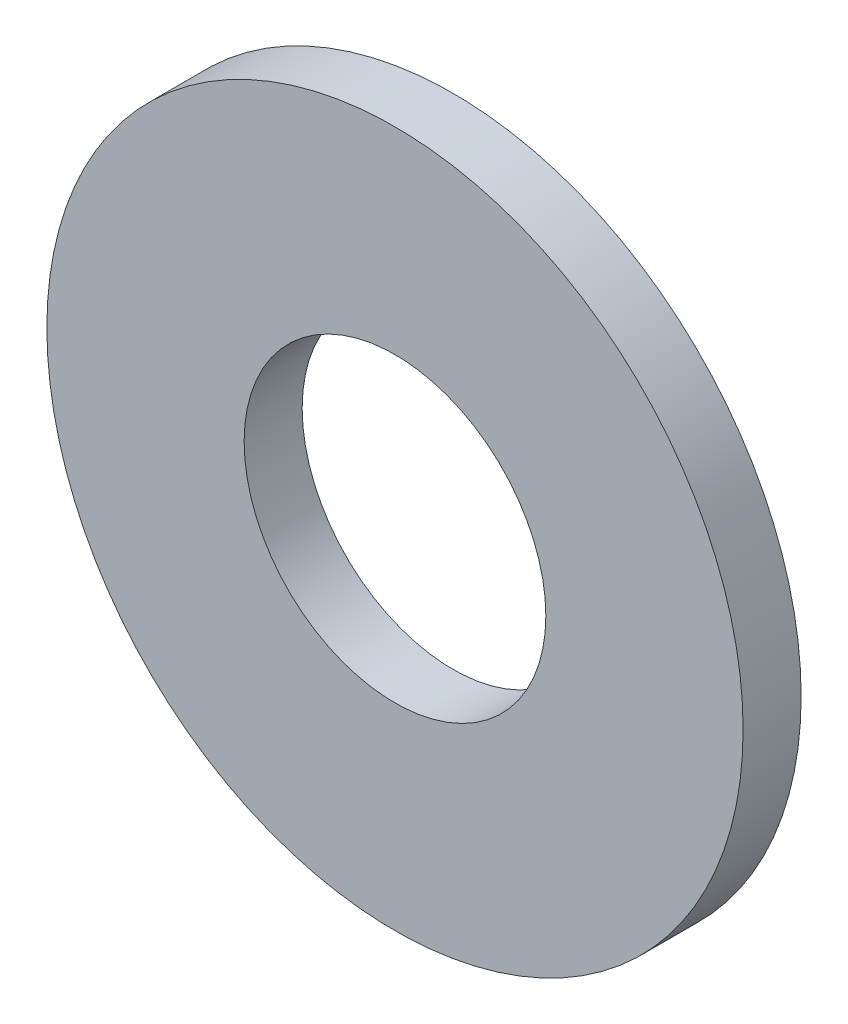
ISO-10303-21;
HEADER;
FILE_DESCRIPTION(('STEP AP214'),'2;1');
FILE_NAME('part.step','',(''),(''),'','','');
FILE_SCHEMA(('AUTOMOTIVE_DESIGN { 1 0 10303 214 1 1 1 1 }'));
ENDSEC;
DATA;
#1=APPLICATION_CONTEXT('core data for automotive mechanical design processes');
#2=APPLICATION_PROTOCOL_DEFINITION('international standard','automotive_design',2000,#1);
#3=PRODUCT_CONTEXT('',#1,'mechanical');
#4=PRODUCT('Part','Part','',(#3));
#5=PRODUCT_RELATED_PRODUCT_CATEGORY('part','',(#4));
#6=PRODUCT_DEFINITION_FORMATION('','',#4);
#7=PRODUCT_DEFINITION_CONTEXT('part definition',#1,'design');
#8=PRODUCT_DEFINITION('design','',#6,#7);
#9=PRODUCT_DEFINITION_SHAPE('','',#8);
#10=(LENGTH_UNIT() NAMED_UNIT(*) SI_UNIT(.MILLI.,.METRE.));
#11=(NAMED_UNIT(*) PLANE_ANGLE_UNIT() SI_UNIT($,.RADIAN.));
#12=(NAMED_UNIT(*) SI_UNIT($,.STERADIAN.) SOLID_ANGLE_UNIT());
#13=UNCERTAINTY_MEASURE_WITH_UNIT(LENGTH_MEASURE(1.E-05),#10,'distance_accuracy_value','');
#14=(GEOMETRIC_REPRESENTATION_CONTEXT(3) GLOBAL_UNCERTAINTY_ASSIGNED_CONTEXT((#13)) GLOBAL_UNIT_ASSIGNED_CONTEXT((#10,
#11,#12)) REPRESENTATION_CONTEXT('',''));
#15=CARTESIAN_POINT('',(0.,0.,0.));
#16=DIRECTION('',(0.,0.,1.));
#17=DIRECTION('',(1.,0.,0.));
#18=AXIS2_PLACEMENT_3D('',#15,#16,#17);
#19=CARTESIAN_POINT('',(0.,0.,1.));
#20=DIRECTION('',(0.,0.,1.));
#21=DIRECTION('',(1.,0.,0.));
#22=AXIS2_PLACEMENT_3D('',#19,#20,#21);
#23=PLANE('',#22);
#24=CARTESIAN_POINT('',(0.,0.,1.));
#25=DIRECTION('',(0.,0.,1.));
#26=DIRECTION('',(1.,0.,0.));
#27=AXIS2_PLACEMENT_3D('',#24,#25,#26);
#28=CIRCLE('',#27,6.);
#29=CARTESIAN_POINT('',(6.,0.,1.));
#30=VERTEX_POINT('',#29);
#31=EDGE_CURVE('E10',#30,#30,#28,.T.);
#32=ORIENTED_EDGE('',*,*,#31,.T.);
#33=EDGE_LOOP('',(#32));
#34=FACE_BOUND('',#33,.T.);
#35=CARTESIAN_POINT('',(0.,0.,1.));
#36=DIRECTION('',(0.,0.,1.));
#37=DIRECTION('',(1.,0.,0.));
#38=AXIS2_PLACEMENT_3D('',#35,#36,#37);
#39=CIRCLE('',#38,2.6);
#40=CARTESIAN_POINT('',(2.6,0.,1.));
#41=VERTEX_POINT('',#40);
#42=EDGE_CURVE('E42',#41,#41,#39,.T.);
#43=ORIENTED_EDGE('',*,*,#42,.F.);
#44=EDGE_LOOP('',(#43));
#45=FACE_BOUND('',#44,.T.);
#46=ADVANCED_FACE('F31',(#34,#45),#23,.T.);
#47=CARTESIAN_POINT('',(0.,0.,0.));
#48=DIRECTION('',(0.,0.,1.));
#49=DIRECTION('',(1.,0.,0.));
#50=AXIS2_PLACEMENT_3D('',#47,#48,#49);
#51=PLANE('',#50);
#52=CARTESIAN_POINT('',(0.,0.,0.));
#53=DIRECTION('',(0.,0.,1.));
#54=DIRECTION('',(1.,0.,0.));
#55=AXIS2_PLACEMENT_3D('',#52,#53,#54);
#56=CIRCLE('',#55,6.);
#57=CARTESIAN_POINT('',(6.,0.,0.));
#58=VERTEX_POINT('',#57);
#59=EDGE_CURVE('E35',#58,#58,#56,.T.);
#60=ORIENTED_EDGE('',*,*,#59,.F.);
#61=EDGE_LOOP('',(#60));
#62=FACE_BOUND('',#61,.T.);
#63=CARTESIAN_POINT('',(0.,0.,0.));
#64=DIRECTION('',(0.,0.,1.));
#65=DIRECTION('',(1.,0.,0.));
#66=AXIS2_PLACEMENT_3D('',#63,#64,#65);
#67=CIRCLE('',#66,2.6);
#68=CARTESIAN_POINT('',(2.6,0.,0.));
#69=VERTEX_POINT('',#68);
#70=EDGE_CURVE('E44',#69,#69,#67,.T.);
#71=ORIENTED_EDGE('',*,*,#70,.T.);
#72=EDGE_LOOP('',(#71));
#73=FACE_BOUND('',#72,.T.);
#74=ADVANCED_FACE('F54',(#62,#73),#51,.F.);
#75=CARTESIAN_POINT('',(0.,0.,1.));
#76=DIRECTION('',(0.,0.,-1.));
#77=DIRECTION('',(-1.,0.,0.));
#78=AXIS2_PLACEMENT_3D('',#75,#76,#77);
#79=CYLINDRICAL_SURFACE('',#78,6.);
#80=ORIENTED_EDGE('',*,*,#31,.F.);
#81=EDGE_LOOP('',(#80));
#82=FACE_BOUND('',#81,.T.);
#83=ORIENTED_EDGE('',*,*,#59,.T.);
#84=EDGE_LOOP('',(#83));
#85=FACE_BOUND('',#84,.T.);
#86=ADVANCED_FACE('F33',(#82,#85),#79,.T.);
#87=CARTESIAN_POINT('',(0.,0.,1.));
#88=DIRECTION('',(0.,0.,-1.));
#89=DIRECTION('',(-1.,0.,0.));
#90=AXIS2_PLACEMENT_3D('',#87,#88,#89);
#91=CYLINDRICAL_SURFACE('',#90,2.6);
#92=ORIENTED_EDGE('',*,*,#42,.T.);
#93=EDGE_LOOP('',(#92));
#94=FACE_BOUND('',#93,.T.);
#95=ORIENTED_EDGE('',*,*,#70,.F.);
#96=EDGE_LOOP('',(#95));
#97=FACE_BOUND('',#96,.T.);
#98=ADVANCED_FACE('F50',(#94,#97),#91,.F.);
#99=CLOSED_SHELL('',(#46,#74,#86,#98));
#100=MANIFOLD_SOLID_BREP('B2',#99);
#101=ADVANCED_BREP_SHAPE_REPRESENTATION('',(#18,#100),#14);
#102=SHAPE_DEFINITION_REPRESENTATION(#9,#101);
ENDSEC;
END-ISO-10303-21;
